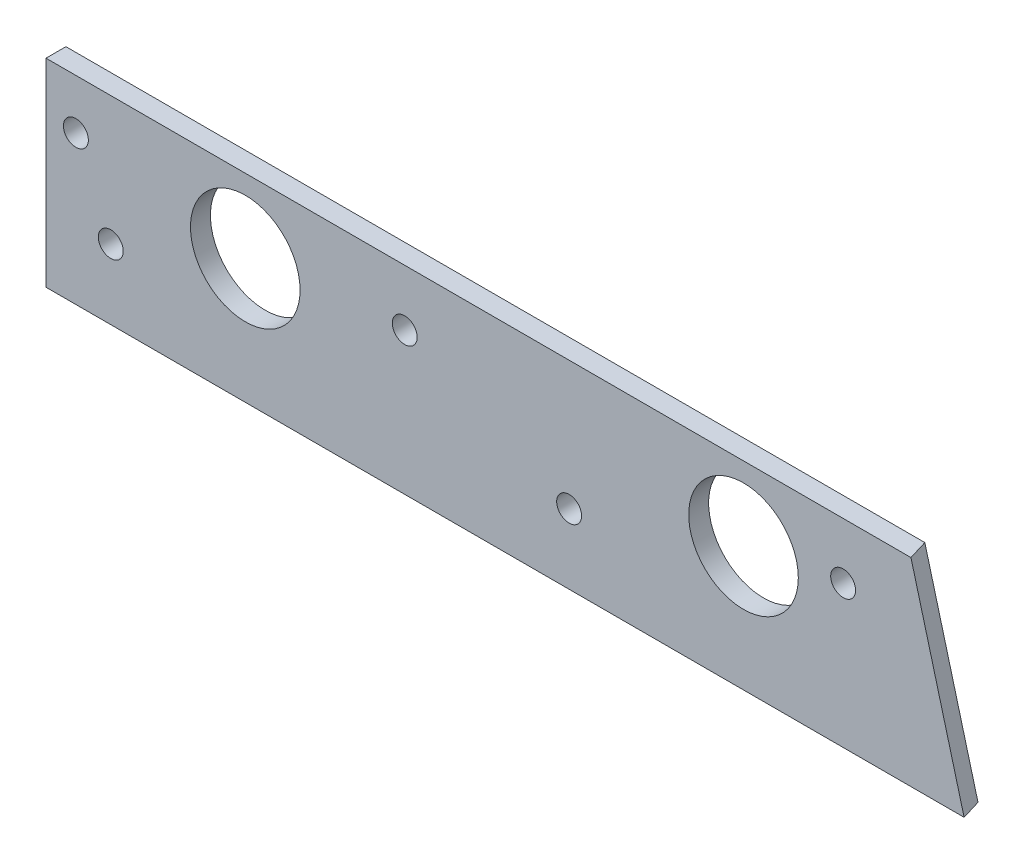
ISO-10303-21;
HEADER;
FILE_DESCRIPTION(('STEP AP214'),'2;1');
FILE_NAME('part.step','',(''),(''),'','','');
FILE_SCHEMA(('AUTOMOTIVE_DESIGN { 1 0 10303 214 1 1 1 1 }'));
ENDSEC;
DATA;
#1=APPLICATION_CONTEXT('core data for automotive mechanical design processes');
#2=APPLICATION_PROTOCOL_DEFINITION('international standard','automotive_design',2000,#1);
#3=PRODUCT_CONTEXT('',#1,'mechanical');
#4=PRODUCT('Part','Part','',(#3));
#5=PRODUCT_RELATED_PRODUCT_CATEGORY('part','',(#4));
#6=PRODUCT_DEFINITION_FORMATION('','',#4);
#7=PRODUCT_DEFINITION_CONTEXT('part definition',#1,'design');
#8=PRODUCT_DEFINITION('design','',#6,#7);
#9=PRODUCT_DEFINITION_SHAPE('','',#8);
#10=(LENGTH_UNIT() NAMED_UNIT(*) SI_UNIT(.MILLI.,.METRE.));
#11=(NAMED_UNIT(*) PLANE_ANGLE_UNIT() SI_UNIT($,.RADIAN.));
#12=(NAMED_UNIT(*) SI_UNIT($,.STERADIAN.) SOLID_ANGLE_UNIT());
#13=UNCERTAINTY_MEASURE_WITH_UNIT(LENGTH_MEASURE(1.E-05),#10,'distance_accuracy_value','');
#14=(GEOMETRIC_REPRESENTATION_CONTEXT(3) GLOBAL_UNCERTAINTY_ASSIGNED_CONTEXT((#13)) GLOBAL_UNIT_ASSIGNED_CONTEXT((#10,
#11,#12)) REPRESENTATION_CONTEXT('',''));
#15=CARTESIAN_POINT('',(0.,0.,0.));
#16=DIRECTION('',(0.,0.,1.));
#17=DIRECTION('',(1.,0.,0.));
#18=AXIS2_PLACEMENT_3D('',#15,#16,#17);
#19=CARTESIAN_POINT('',(0.,0.,4.));
#20=DIRECTION('',(0.,0.,-1.));
#21=DIRECTION('',(-1.,0.,0.));
#22=AXIS2_PLACEMENT_3D('',#19,#20,#21);
#23=PLANE('',#22);
#24=DIRECTION('',(1.,0.,0.));
#25=VECTOR('',#24,1.);
#26=CARTESIAN_POINT('',(-105.,-30.0000000000004,4.));
#27=LINE('',#26,#25);
#28=CARTESIAN_POINT('',(-105.,-30.0000000000004,4.));
#29=VERTEX_POINT('',#28);
#30=CARTESIAN_POINT('',(79.2808161615735,-30.,4.));
#31=VERTEX_POINT('',#30);
#32=EDGE_CURVE('E93',#29,#31,#27,.T.);
#33=ORIENTED_EDGE('',*,*,#32,.T.);
#34=DIRECTION('',(-0.258819045102522,0.965925826289068,0.));
#35=VECTOR('',#34,1.);
#36=CARTESIAN_POINT('',(79.3382413276307,-30.2143136373588,4.));
#37=LINE('',#36,#35);
#38=CARTESIAN_POINT('',(68.6101482578959,9.82347476721915,4.));
#39=VERTEX_POINT('',#38);
#40=EDGE_CURVE('E82',#31,#39,#37,.T.);
#41=ORIENTED_EDGE('',*,*,#40,.T.);
#42=DIRECTION('',(-1.,0.,0.));
#43=VECTOR('',#42,1.);
#44=CARTESIAN_POINT('',(69.4674028073311,9.82347476721915,4.));
#45=LINE('',#44,#43);
#46=CARTESIAN_POINT('',(-105.,9.82347476721915,4.));
#47=VERTEX_POINT('',#46);
#48=EDGE_CURVE('E76',#39,#47,#45,.T.);
#49=ORIENTED_EDGE('',*,*,#48,.T.);
#50=DIRECTION('',(0.,-1.,0.));
#51=VECTOR('',#50,1.);
#52=CARTESIAN_POINT('',(-105.,-30.0000000000004,4.));
#53=LINE('',#52,#51);
#54=EDGE_CURVE('E80',#47,#29,#53,.T.);
#55=ORIENTED_EDGE('',*,*,#54,.T.);
#56=EDGE_LOOP('',(#33,#41,#49,#55));
#57=FACE_BOUND('',#56,.T.);
#58=CARTESIAN_POINT('',(35.,-5.,4.));
#59=DIRECTION('',(0.,0.,1.));
#60=DIRECTION('',(1.,0.,0.));
#61=AXIS2_PLACEMENT_3D('',#58,#59,#60);
#62=CIRCLE('',#61,11.);
#63=CARTESIAN_POINT('',(46.,-5.,4.));
#64=VERTEX_POINT('',#63);
#65=EDGE_CURVE('E114',#64,#64,#62,.T.);
#66=ORIENTED_EDGE('',*,*,#65,.F.);
#67=EDGE_LOOP('',(#66));
#68=FACE_BOUND('',#67,.T.);
#69=CARTESIAN_POINT('',(-65.,-5.,4.));
#70=DIRECTION('',(0.,0.,1.));
#71=DIRECTION('',(1.,0.,0.));
#72=AXIS2_PLACEMENT_3D('',#69,#70,#71);
#73=CIRCLE('',#72,11.);
#74=CARTESIAN_POINT('',(-54.,-5.,4.));
#75=VERTEX_POINT('',#74);
#76=EDGE_CURVE('E119',#75,#75,#73,.T.);
#77=ORIENTED_EDGE('',*,*,#76,.F.);
#78=EDGE_LOOP('',(#77));
#79=FACE_BOUND('',#78,.T.);
#80=CARTESIAN_POINT('',(0.,-16.0000000000004,4.));
#81=DIRECTION('',(0.,0.,1.));
#82=DIRECTION('',(1.,0.,0.));
#83=AXIS2_PLACEMENT_3D('',#80,#81,#82);
#84=CIRCLE('',#83,2.5);
#85=CARTESIAN_POINT('',(2.5,-16.0000000000004,4.));
#86=VERTEX_POINT('',#85);
#87=EDGE_CURVE('E125',#86,#86,#84,.T.);
#88=ORIENTED_EDGE('',*,*,#87,.F.);
#89=EDGE_LOOP('',(#88));
#90=FACE_BOUND('',#89,.T.);
#91=CARTESIAN_POINT('',(-91.9999999999999,-16.0000000000004,4.));
#92=DIRECTION('',(0.,0.,1.));
#93=DIRECTION('',(1.,0.,0.));
#94=AXIS2_PLACEMENT_3D('',#91,#92,#93);
#95=CIRCLE('',#94,2.49999999999999);
#96=CARTESIAN_POINT('',(-89.4999999999999,-16.0000000000004,4.));
#97=VERTEX_POINT('',#96);
#98=EDGE_CURVE('E131',#97,#97,#95,.T.);
#99=ORIENTED_EDGE('',*,*,#98,.F.);
#100=EDGE_LOOP('',(#99));
#101=FACE_BOUND('',#100,.T.);
#102=CARTESIAN_POINT('',(-98.9999999999999,-0.176525232780892,4.));
#103=DIRECTION('',(0.,0.,1.));
#104=DIRECTION('',(1.,0.,0.));
#105=AXIS2_PLACEMENT_3D('',#102,#103,#104);
#106=CIRCLE('',#105,2.49999999999999);
#107=CARTESIAN_POINT('',(-96.4999999999999,-0.176525232780892,4.));
#108=VERTEX_POINT('',#107);
#109=EDGE_CURVE('E137',#108,#108,#106,.T.);
#110=ORIENTED_EDGE('',*,*,#109,.F.);
#111=EDGE_LOOP('',(#110));
#112=FACE_BOUND('',#111,.T.);
#113=CARTESIAN_POINT('',(-32.9999999999999,-1.45316378927537,4.));
#114=DIRECTION('',(0.,0.,1.));
#115=DIRECTION('',(1.,0.,0.));
#116=AXIS2_PLACEMENT_3D('',#113,#114,#115);
#117=CIRCLE('',#116,2.49999999999999);
#118=CARTESIAN_POINT('',(-30.4999999999999,-1.45316378927537,4.));
#119=VERTEX_POINT('',#118);
#120=EDGE_CURVE('E143',#119,#119,#117,.T.);
#121=ORIENTED_EDGE('',*,*,#120,.F.);
#122=EDGE_LOOP('',(#121));
#123=FACE_BOUND('',#122,.T.);
#124=CARTESIAN_POINT('',(55.0000000000001,-1.45316378927537,4.));
#125=DIRECTION('',(0.,0.,1.));
#126=DIRECTION('',(1.,0.,0.));
#127=AXIS2_PLACEMENT_3D('',#124,#125,#126);
#128=CIRCLE('',#127,2.49999999999999);
#129=CARTESIAN_POINT('',(57.5000000000001,-1.45316378927537,4.));
#130=VERTEX_POINT('',#129);
#131=EDGE_CURVE('E149',#130,#130,#128,.T.);
#132=ORIENTED_EDGE('',*,*,#131,.F.);
#133=EDGE_LOOP('',(#132));
#134=FACE_BOUND('',#133,.T.);
#135=ADVANCED_FACE('F36',(#57,#68,#79,#90,#101,#112,#123,#134),#23,.F.);
#136=CARTESIAN_POINT('',(0.,0.,0.));
#137=DIRECTION('',(0.,0.,-1.));
#138=DIRECTION('',(-1.,0.,0.));
#139=AXIS2_PLACEMENT_3D('',#136,#137,#138);
#140=PLANE('',#139);
#141=CARTESIAN_POINT('',(-32.9999999999999,-1.45316378927537,0.));
#142=DIRECTION('',(0.,0.,1.));
#143=DIRECTION('',(1.,0.,0.));
#144=AXIS2_PLACEMENT_3D('',#141,#142,#143);
#145=CIRCLE('',#144,2.49999999999999);
#146=CARTESIAN_POINT('',(-30.4999999999999,-1.45316378927537,0.));
#147=VERTEX_POINT('',#146);
#148=EDGE_CURVE('E146',#147,#147,#145,.T.);
#149=ORIENTED_EDGE('',*,*,#148,.T.);
#150=EDGE_LOOP('',(#149));
#151=FACE_BOUND('',#150,.T.);
#152=CARTESIAN_POINT('',(-91.9999999999999,-16.0000000000004,0.));
#153=DIRECTION('',(0.,0.,1.));
#154=DIRECTION('',(1.,0.,0.));
#155=AXIS2_PLACEMENT_3D('',#152,#153,#154);
#156=CIRCLE('',#155,2.49999999999999);
#157=CARTESIAN_POINT('',(-89.4999999999999,-16.0000000000004,0.));
#158=VERTEX_POINT('',#157);
#159=EDGE_CURVE('E134',#158,#158,#156,.T.);
#160=ORIENTED_EDGE('',*,*,#159,.T.);
#161=EDGE_LOOP('',(#160));
#162=FACE_BOUND('',#161,.T.);
#163=CARTESIAN_POINT('',(-65.,-5.,0.));
#164=DIRECTION('',(0.,0.,1.));
#165=DIRECTION('',(1.,0.,0.));
#166=AXIS2_PLACEMENT_3D('',#163,#164,#165);
#167=CIRCLE('',#166,11.);
#168=CARTESIAN_POINT('',(-54.,-5.,0.));
#169=VERTEX_POINT('',#168);
#170=EDGE_CURVE('E122',#169,#169,#167,.T.);
#171=ORIENTED_EDGE('',*,*,#170,.T.);
#172=EDGE_LOOP('',(#171));
#173=FACE_BOUND('',#172,.T.);
#174=DIRECTION('',(-1.,0.,0.));
#175=VECTOR('',#174,1.);
#176=CARTESIAN_POINT('',(69.4674028073311,9.82347476721915,0.));
#177=LINE('',#176,#175);
#178=CARTESIAN_POINT('',(67.3968504465109,9.82347476721915,0.));
#179=VERTEX_POINT('',#178);
#180=CARTESIAN_POINT('',(-105.,9.82347476721915,0.));
#181=VERTEX_POINT('',#180);
#182=EDGE_CURVE('E96',#179,#181,#177,.T.);
#183=ORIENTED_EDGE('',*,*,#182,.F.);
#184=DIRECTION('',(0.258819045102522,-0.965925826289068,0.));
#185=VECTOR('',#184,1.);
#186=CARTESIAN_POINT('',(78.2062190584305,-30.5176380902051,0.));
#187=LINE('',#186,#185);
#188=CARTESIAN_POINT('',(78.0675183501885,-30.,0.));
#189=VERTEX_POINT('',#188);
#190=EDGE_CURVE('E45',#179,#189,#187,.T.);
#191=ORIENTED_EDGE('',*,*,#190,.T.);
#192=DIRECTION('',(1.,0.,0.));
#193=VECTOR('',#192,1.);
#194=CARTESIAN_POINT('',(-105.,-30.0000000000004,0.));
#195=LINE('',#194,#193);
#196=CARTESIAN_POINT('',(-105.,-30.0000000000004,0.));
#197=VERTEX_POINT('',#196);
#198=EDGE_CURVE('E84',#197,#189,#195,.T.);
#199=ORIENTED_EDGE('',*,*,#198,.F.);
#200=DIRECTION('',(0.,-1.,0.));
#201=VECTOR('',#200,1.);
#202=CARTESIAN_POINT('',(-105.,-30.0000000000004,0.));
#203=LINE('',#202,#201);
#204=EDGE_CURVE('E110',#181,#197,#203,.T.);
#205=ORIENTED_EDGE('',*,*,#204,.F.);
#206=EDGE_LOOP('',(#183,#191,#199,#205));
#207=FACE_BOUND('',#206,.T.);
#208=CARTESIAN_POINT('',(35.,-5.,0.));
#209=DIRECTION('',(0.,0.,1.));
#210=DIRECTION('',(1.,0.,0.));
#211=AXIS2_PLACEMENT_3D('',#208,#209,#210);
#212=CIRCLE('',#211,11.);
#213=CARTESIAN_POINT('',(46.,-5.,0.));
#214=VERTEX_POINT('',#213);
#215=EDGE_CURVE('E116',#214,#214,#212,.T.);
#216=ORIENTED_EDGE('',*,*,#215,.T.);
#217=EDGE_LOOP('',(#216));
#218=FACE_BOUND('',#217,.T.);
#219=CARTESIAN_POINT('',(0.,-16.0000000000004,0.));
#220=DIRECTION('',(0.,0.,1.));
#221=DIRECTION('',(1.,0.,0.));
#222=AXIS2_PLACEMENT_3D('',#219,#220,#221);
#223=CIRCLE('',#222,2.5);
#224=CARTESIAN_POINT('',(2.5,-16.0000000000004,0.));
#225=VERTEX_POINT('',#224);
#226=EDGE_CURVE('E128',#225,#225,#223,.T.);
#227=ORIENTED_EDGE('',*,*,#226,.T.);
#228=EDGE_LOOP('',(#227));
#229=FACE_BOUND('',#228,.T.);
#230=CARTESIAN_POINT('',(-98.9999999999999,-0.176525232780892,0.));
#231=DIRECTION('',(0.,0.,1.));
#232=DIRECTION('',(1.,0.,0.));
#233=AXIS2_PLACEMENT_3D('',#230,#231,#232);
#234=CIRCLE('',#233,2.49999999999999);
#235=CARTESIAN_POINT('',(-96.4999999999999,-0.176525232780892,0.));
#236=VERTEX_POINT('',#235);
#237=EDGE_CURVE('E140',#236,#236,#234,.T.);
#238=ORIENTED_EDGE('',*,*,#237,.T.);
#239=EDGE_LOOP('',(#238));
#240=FACE_BOUND('',#239,.T.);
#241=CARTESIAN_POINT('',(55.0000000000001,-1.45316378927537,0.));
#242=DIRECTION('',(0.,0.,1.));
#243=DIRECTION('',(1.,0.,0.));
#244=AXIS2_PLACEMENT_3D('',#241,#242,#243);
#245=CIRCLE('',#244,2.49999999999999);
#246=CARTESIAN_POINT('',(57.5000000000001,-1.45316378927537,0.));
#247=VERTEX_POINT('',#246);
#248=EDGE_CURVE('E152',#247,#247,#245,.T.);
#249=ORIENTED_EDGE('',*,*,#248,.T.);
#250=EDGE_LOOP('',(#249));
#251=FACE_BOUND('',#250,.T.);
#252=ADVANCED_FACE('F106',(#151,#162,#173,#207,#218,#229,#240,#251),#140,.T.);
#253=CARTESIAN_POINT('',(69.4674028073311,9.82347476721915,4.));
#254=DIRECTION('',(0.,-1.,0.));
#255=DIRECTION('',(0.,0.,-1.));
#256=AXIS2_PLACEMENT_3D('',#253,#254,#255);
#257=PLANE('',#256);
#258=ORIENTED_EDGE('',*,*,#48,.F.);
#259=DIRECTION('',(-0.290265196178641,0.,-0.956946245035412));
#260=VECTOR('',#259,1.);
#261=CARTESIAN_POINT('',(70.3664480242918,9.82347476721915,9.79016874477378));
#262=LINE('',#261,#260);
#263=EDGE_CURVE('E58',#39,#179,#262,.T.);
#264=ORIENTED_EDGE('',*,*,#263,.T.);
#265=ORIENTED_EDGE('',*,*,#182,.T.);
#266=DIRECTION('',(0.,0.,-1.));
#267=VECTOR('',#266,1.);
#268=CARTESIAN_POINT('',(-105.,9.82347476721915,4.));
#269=LINE('',#268,#267);
#270=EDGE_CURVE('E89',#47,#181,#269,.T.);
#271=ORIENTED_EDGE('',*,*,#270,.F.);
#272=EDGE_LOOP('',(#258,#264,#265,#271));
#273=FACE_BOUND('',#272,.T.);
#274=ADVANCED_FACE('F95',(#273),#257,.F.);
#275=CARTESIAN_POINT('',(-105.,-30.0000000000004,4.));
#276=DIRECTION('',(1.,0.,0.));
#277=DIRECTION('',(0.,1.,0.));
#278=AXIS2_PLACEMENT_3D('',#275,#276,#277);
#279=PLANE('',#278);
#280=ORIENTED_EDGE('',*,*,#204,.T.);
#281=DIRECTION('',(0.,0.,-1.));
#282=VECTOR('',#281,1.);
#283=CARTESIAN_POINT('',(-105.,-30.0000000000004,4.));
#284=LINE('',#283,#282);
#285=EDGE_CURVE('E91',#29,#197,#284,.T.);
#286=ORIENTED_EDGE('',*,*,#285,.F.);
#287=ORIENTED_EDGE('',*,*,#54,.F.);
#288=ORIENTED_EDGE('',*,*,#270,.T.);
#289=EDGE_LOOP('',(#280,#286,#287,#288));
#290=FACE_BOUND('',#289,.T.);
#291=ADVANCED_FACE('F88',(#290),#279,.F.);
#292=CARTESIAN_POINT('',(-105.,-30.0000000000004,4.));
#293=DIRECTION('',(0.,1.,0.));
#294=DIRECTION('',(-1.,0.,0.));
#295=AXIS2_PLACEMENT_3D('',#292,#293,#294);
#296=PLANE('',#295);
#297=ORIENTED_EDGE('',*,*,#198,.T.);
#298=DIRECTION('',(0.29026519617864,0.,0.956946245035412));
#299=VECTOR('',#298,1.);
#300=CARTESIAN_POINT('',(80.1380707110087,-30.,6.82619663990538));
#301=LINE('',#300,#299);
#302=EDGE_CURVE('E11',#189,#31,#301,.T.);
#303=ORIENTED_EDGE('',*,*,#302,.T.);
#304=ORIENTED_EDGE('',*,*,#32,.F.);
#305=ORIENTED_EDGE('',*,*,#285,.T.);
#306=EDGE_LOOP('',(#297,#303,#304,#305));
#307=FACE_BOUND('',#306,.T.);
#308=ADVANCED_FACE('F109',(#307),#296,.F.);
#309=CARTESIAN_POINT('',(35.,-5.,4.));
#310=DIRECTION('',(0.,0.,-1.));
#311=DIRECTION('',(-1.,0.,0.));
#312=AXIS2_PLACEMENT_3D('',#309,#310,#311);
#313=CYLINDRICAL_SURFACE('',#312,11.);
#314=ORIENTED_EDGE('',*,*,#65,.T.);
#315=EDGE_LOOP('',(#314));
#316=FACE_BOUND('',#315,.T.);
#317=ORIENTED_EDGE('',*,*,#215,.F.);
#318=EDGE_LOOP('',(#317));
#319=FACE_BOUND('',#318,.T.);
#320=ADVANCED_FACE('F169',(#316,#319),#313,.F.);
#321=CARTESIAN_POINT('',(-65.,-5.,4.));
#322=DIRECTION('',(0.,0.,-1.));
#323=DIRECTION('',(-1.,0.,0.));
#324=AXIS2_PLACEMENT_3D('',#321,#322,#323);
#325=CYLINDRICAL_SURFACE('',#324,11.);
#326=ORIENTED_EDGE('',*,*,#76,.T.);
#327=EDGE_LOOP('',(#326));
#328=FACE_BOUND('',#327,.T.);
#329=ORIENTED_EDGE('',*,*,#170,.F.);
#330=EDGE_LOOP('',(#329));
#331=FACE_BOUND('',#330,.T.);
#332=ADVANCED_FACE('F195',(#328,#331),#325,.F.);
#333=CARTESIAN_POINT('',(0.,-16.0000000000004,4.));
#334=DIRECTION('',(0.,0.,-1.));
#335=DIRECTION('',(-1.,0.,0.));
#336=AXIS2_PLACEMENT_3D('',#333,#334,#335);
#337=CYLINDRICAL_SURFACE('',#336,2.5);
#338=ORIENTED_EDGE('',*,*,#87,.T.);
#339=EDGE_LOOP('',(#338));
#340=FACE_BOUND('',#339,.T.);
#341=ORIENTED_EDGE('',*,*,#226,.F.);
#342=EDGE_LOOP('',(#341));
#343=FACE_BOUND('',#342,.T.);
#344=ADVANCED_FACE('F202',(#340,#343),#337,.F.);
#345=CARTESIAN_POINT('',(-91.9999999999999,-16.0000000000004,4.));
#346=DIRECTION('',(0.,0.,-1.));
#347=DIRECTION('',(-1.,0.,0.));
#348=AXIS2_PLACEMENT_3D('',#345,#346,#347);
#349=CYLINDRICAL_SURFACE('',#348,2.49999999999999);
#350=ORIENTED_EDGE('',*,*,#98,.T.);
#351=EDGE_LOOP('',(#350));
#352=FACE_BOUND('',#351,.T.);
#353=ORIENTED_EDGE('',*,*,#159,.F.);
#354=EDGE_LOOP('',(#353));
#355=FACE_BOUND('',#354,.T.);
#356=ADVANCED_FACE('F209',(#352,#355),#349,.F.);
#357=CARTESIAN_POINT('',(-98.9999999999999,-0.176525232780892,4.));
#358=DIRECTION('',(0.,0.,-1.));
#359=DIRECTION('',(-1.,0.,0.));
#360=AXIS2_PLACEMENT_3D('',#357,#358,#359);
#361=CYLINDRICAL_SURFACE('',#360,2.49999999999999);
#362=ORIENTED_EDGE('',*,*,#109,.T.);
#363=EDGE_LOOP('',(#362));
#364=FACE_BOUND('',#363,.T.);
#365=ORIENTED_EDGE('',*,*,#237,.F.);
#366=EDGE_LOOP('',(#365));
#367=FACE_BOUND('',#366,.T.);
#368=ADVANCED_FACE('F217',(#364,#367),#361,.F.);
#369=CARTESIAN_POINT('',(-32.9999999999999,-1.45316378927537,4.));
#370=DIRECTION('',(0.,0.,-1.));
#371=DIRECTION('',(-1.,0.,0.));
#372=AXIS2_PLACEMENT_3D('',#369,#370,#371);
#373=CYLINDRICAL_SURFACE('',#372,2.49999999999999);
#374=ORIENTED_EDGE('',*,*,#120,.T.);
#375=EDGE_LOOP('',(#374));
#376=FACE_BOUND('',#375,.T.);
#377=ORIENTED_EDGE('',*,*,#148,.F.);
#378=EDGE_LOOP('',(#377));
#379=FACE_BOUND('',#378,.T.);
#380=ADVANCED_FACE('F225',(#376,#379),#373,.F.);
#381=CARTESIAN_POINT('',(55.0000000000001,-1.45316378927537,4.));
#382=DIRECTION('',(0.,0.,-1.));
#383=DIRECTION('',(-1.,0.,0.));
#384=AXIS2_PLACEMENT_3D('',#381,#382,#383);
#385=CYLINDRICAL_SURFACE('',#384,2.49999999999999);
#386=ORIENTED_EDGE('',*,*,#131,.T.);
#387=EDGE_LOOP('',(#386));
#388=FACE_BOUND('',#387,.T.);
#389=ORIENTED_EDGE('',*,*,#248,.F.);
#390=EDGE_LOOP('',(#389));
#391=FACE_BOUND('',#390,.T.);
#392=ADVANCED_FACE('F158',(#388,#391),#385,.F.);
#393=CARTESIAN_POINT('',(80.1380707110087,-30.,6.82619663990538));
#394=DIRECTION('',(0.926958643333799,0.248377819898341,-0.281169223300328));
#395=DIRECTION('',(0.258819045102522,-0.965925826289068,0.));
#396=AXIS2_PLACEMENT_3D('',#393,#394,#395);
#397=PLANE('',#396);
#398=ORIENTED_EDGE('',*,*,#302,.F.);
#399=ORIENTED_EDGE('',*,*,#190,.F.);
#400=ORIENTED_EDGE('',*,*,#263,.F.);
#401=ORIENTED_EDGE('',*,*,#40,.F.);
#402=EDGE_LOOP('',(#398,#399,#400,#401));
#403=FACE_BOUND('',#402,.T.);
#404=ADVANCED_FACE('F39',(#403),#397,.T.);
#405=CLOSED_SHELL('',(#135,#252,#274,#291,#308,#320,#332,#344,#356,#368,#380,#392,#404));
#406=MANIFOLD_SOLID_BREP('B2',#405);
#407=ADVANCED_BREP_SHAPE_REPRESENTATION('',(#18,#406),#14);
#408=SHAPE_DEFINITION_REPRESENTATION(#9,#407);
ENDSEC;
END-ISO-10303-21;
